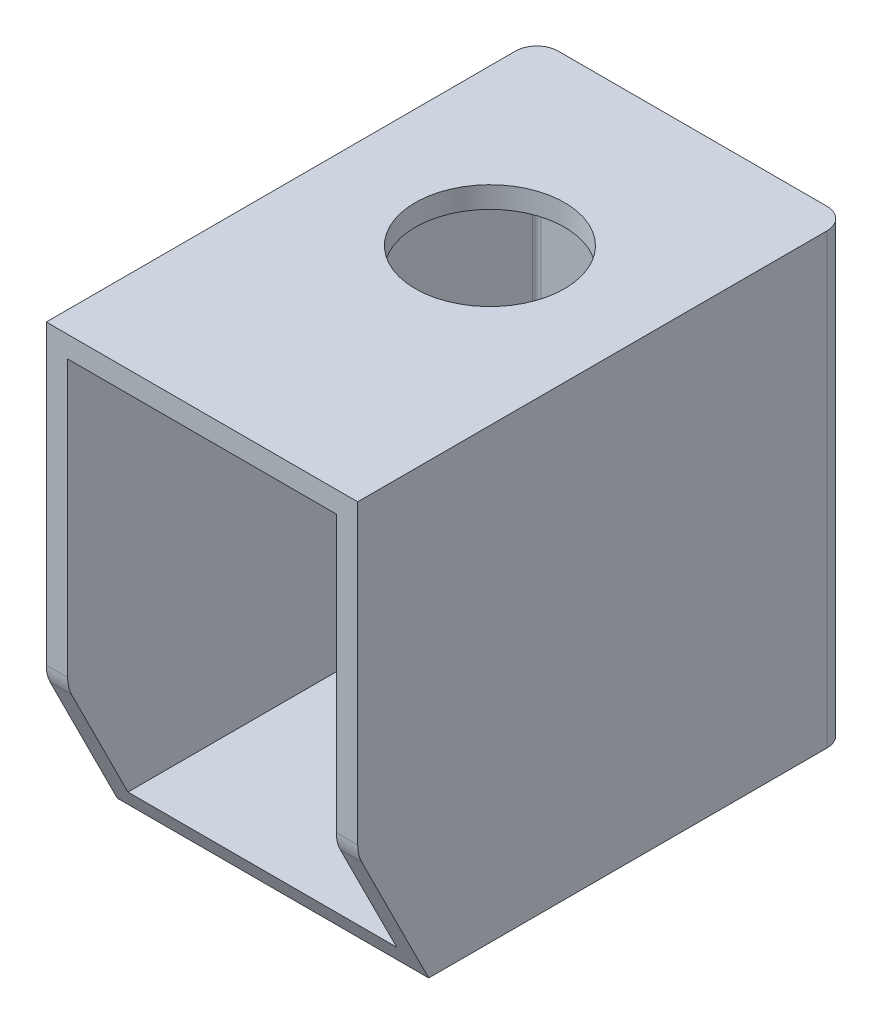
ISO-10303-21;
HEADER;
FILE_DESCRIPTION(('STEP AP214'),'2;1');
FILE_NAME('part.step','',(''),(''),'','','');
FILE_SCHEMA(('AUTOMOTIVE_DESIGN { 1 0 10303 214 1 1 1 1 }'));
ENDSEC;
DATA;
#1=APPLICATION_CONTEXT('core data for automotive mechanical design processes');
#2=APPLICATION_PROTOCOL_DEFINITION('international standard','automotive_design',2000,#1);
#3=PRODUCT_CONTEXT('',#1,'mechanical');
#4=PRODUCT('Part','Part','',(#3));
#5=PRODUCT_RELATED_PRODUCT_CATEGORY('part','',(#4));
#6=PRODUCT_DEFINITION_FORMATION('','',#4);
#7=PRODUCT_DEFINITION_CONTEXT('part definition',#1,'design');
#8=PRODUCT_DEFINITION('design','',#6,#7);
#9=PRODUCT_DEFINITION_SHAPE('','',#8);
#10=(LENGTH_UNIT() NAMED_UNIT(*) SI_UNIT(.MILLI.,.METRE.));
#11=(NAMED_UNIT(*) PLANE_ANGLE_UNIT() SI_UNIT($,.RADIAN.));
#12=(NAMED_UNIT(*) SI_UNIT($,.STERADIAN.) SOLID_ANGLE_UNIT());
#13=UNCERTAINTY_MEASURE_WITH_UNIT(LENGTH_MEASURE(1.E-05),#10,'distance_accuracy_value','');
#14=(GEOMETRIC_REPRESENTATION_CONTEXT(3) GLOBAL_UNCERTAINTY_ASSIGNED_CONTEXT((#13)) GLOBAL_UNIT_ASSIGNED_CONTEXT((#10,
#11,#12)) REPRESENTATION_CONTEXT('',''));
#15=CARTESIAN_POINT('',(0.,0.,0.));
#16=DIRECTION('',(0.,0.,1.));
#17=DIRECTION('',(1.,0.,0.));
#18=AXIS2_PLACEMENT_3D('',#15,#16,#17);
#19=CARTESIAN_POINT('',(-7.3,10.5,11.5));
#20=DIRECTION('',(0.,0.,-1.));
#21=DIRECTION('',(-1.,0.,0.));
#22=AXIS2_PLACEMENT_3D('',#19,#20,#21);
#23=PLANE('',#22);
#24=DIRECTION('',(0.,-1.,0.));
#25=VECTOR('',#24,1.);
#26=CARTESIAN_POINT('',(6.3,10.5,11.5));
#27=LINE('',#26,#25);
#28=CARTESIAN_POINT('',(6.3,9.5,11.5));
#29=VERTEX_POINT('',#28);
#30=CARTESIAN_POINT('',(6.3,-3.43396166652762,11.5));
#31=VERTEX_POINT('',#30);
#32=EDGE_CURVE('E245',#29,#31,#27,.T.);
#33=ORIENTED_EDGE('',*,*,#32,.T.);
#34=DIRECTION('',(1.,0.,0.));
#35=VECTOR('',#34,1.);
#36=CARTESIAN_POINT('',(7.3,-3.43396166652762,11.5));
#37=LINE('',#36,#35);
#38=CARTESIAN_POINT('',(7.3,-3.43396166652761,11.5));
#39=VERTEX_POINT('',#38);
#40=EDGE_CURVE('E230',#31,#39,#37,.T.);
#41=ORIENTED_EDGE('',*,*,#40,.T.);
#42=DIRECTION('',(0.,-1.,0.));
#43=VECTOR('',#42,1.);
#44=CARTESIAN_POINT('',(7.3,10.5,11.5));
#45=LINE('',#44,#43);
#46=CARTESIAN_POINT('',(7.3,10.5,11.5));
#47=VERTEX_POINT('',#46);
#48=EDGE_CURVE('E183',#47,#39,#45,.T.);
#49=ORIENTED_EDGE('',*,*,#48,.F.);
#50=DIRECTION('',(1.,0.,0.));
#51=VECTOR('',#50,1.);
#52=CARTESIAN_POINT('',(-7.3,10.5,11.5));
#53=LINE('',#52,#51);
#54=CARTESIAN_POINT('',(-7.3,10.5,11.5));
#55=VERTEX_POINT('',#54);
#56=EDGE_CURVE('E187',#55,#47,#53,.T.);
#57=ORIENTED_EDGE('',*,*,#56,.F.);
#58=DIRECTION('',(0.,-1.,0.));
#59=VECTOR('',#58,1.);
#60=CARTESIAN_POINT('',(-7.3,10.5,11.5));
#61=LINE('',#60,#59);
#62=CARTESIAN_POINT('',(-7.3,-3.43396166652761,11.5));
#63=VERTEX_POINT('',#62);
#64=EDGE_CURVE('E186',#55,#63,#61,.T.);
#65=ORIENTED_EDGE('',*,*,#64,.T.);
#66=DIRECTION('',(1.,0.,0.));
#67=VECTOR('',#66,1.);
#68=CARTESIAN_POINT('',(-6.3,-3.43396166652762,11.5));
#69=LINE('',#68,#67);
#70=CARTESIAN_POINT('',(-6.3,-3.43396166652762,11.5));
#71=VERTEX_POINT('',#70);
#72=EDGE_CURVE('E227',#63,#71,#69,.T.);
#73=ORIENTED_EDGE('',*,*,#72,.T.);
#74=DIRECTION('',(0.,-1.,0.));
#75=VECTOR('',#74,1.);
#76=CARTESIAN_POINT('',(-6.3,10.5,11.5));
#77=LINE('',#76,#75);
#78=CARTESIAN_POINT('',(-6.3,9.5,11.5));
#79=VERTEX_POINT('',#78);
#80=EDGE_CURVE('E257',#79,#71,#77,.T.);
#81=ORIENTED_EDGE('',*,*,#80,.F.);
#82=DIRECTION('',(1.,0.,0.));
#83=VECTOR('',#82,1.);
#84=CARTESIAN_POINT('',(-7.3,9.5,11.5));
#85=LINE('',#84,#83);
#86=EDGE_CURVE('E256',#79,#29,#85,.T.);
#87=ORIENTED_EDGE('',*,*,#86,.T.);
#88=EDGE_LOOP('',(#33,#41,#49,#57,#65,#73,#81,#87));
#89=FACE_BOUND('',#88,.T.);
#90=ADVANCED_FACE('F39',(#89),#23,.F.);
#91=CARTESIAN_POINT('',(7.3,10.5,-11.5));
#92=DIRECTION('',(-1.,0.,0.));
#93=DIRECTION('',(0.,0.,1.));
#94=AXIS2_PLACEMENT_3D('',#91,#92,#93);
#95=PLANE('',#94);
#96=ORIENTED_EDGE('',*,*,#48,.T.);
#97=CARTESIAN_POINT('',(7.3,-3.43396166652762,9.74));
#98=DIRECTION('',(-1.,0.,0.));
#99=DIRECTION('',(0.,0.,1.));
#100=AXIS2_PLACEMENT_3D('',#97,#98,#99);
#101=CIRCLE('',#100,1.76);
#102=CARTESIAN_POINT('',(7.3,-4.22200404976221,11.3137182728258));
#103=VERTEX_POINT('',#102);
#104=EDGE_CURVE('E233',#39,#103,#101,.F.);
#105=ORIENTED_EDGE('',*,*,#104,.T.);
#106=DIRECTION('',(0.,0.894158109560136,0.447751354110564));
#107=VECTOR('',#106,1.);
#108=CARTESIAN_POINT('',(7.3,-1.5851978977209,12.6341039098631));
#109=LINE('',#108,#107);
#110=CARTESIAN_POINT('',(7.3,-10.5,8.17));
#111=VERTEX_POINT('',#110);
#112=EDGE_CURVE('E156',#111,#103,#109,.T.);
#113=ORIENTED_EDGE('',*,*,#112,.F.);
#114=DIRECTION('',(0.,0.,-1.));
#115=VECTOR('',#114,1.);
#116=CARTESIAN_POINT('',(7.3,-10.5,-11.5));
#117=LINE('',#116,#115);
#118=CARTESIAN_POINT('',(7.3,-10.5,-10.5));
#119=VERTEX_POINT('',#118);
#120=EDGE_CURVE('E165',#111,#119,#117,.T.);
#121=ORIENTED_EDGE('',*,*,#120,.T.);
#122=DIRECTION('',(0.,-1.,0.));
#123=VECTOR('',#122,1.);
#124=CARTESIAN_POINT('',(7.3,10.5,-10.5));
#125=LINE('',#124,#123);
#126=CARTESIAN_POINT('',(7.3,10.5,-10.5));
#127=VERTEX_POINT('',#126);
#128=EDGE_CURVE('E204',#119,#127,#125,.F.);
#129=ORIENTED_EDGE('',*,*,#128,.T.);
#130=DIRECTION('',(0.,0.,-1.));
#131=VECTOR('',#130,1.);
#132=CARTESIAN_POINT('',(7.3,10.5,-11.5));
#133=LINE('',#132,#131);
#134=EDGE_CURVE('E173',#47,#127,#133,.T.);
#135=ORIENTED_EDGE('',*,*,#134,.F.);
#136=EDGE_LOOP('',(#96,#105,#113,#121,#129,#135));
#137=FACE_BOUND('',#136,.T.);
#138=ADVANCED_FACE('F261',(#137),#95,.F.);
#139=CARTESIAN_POINT('',(-7.3,10.5,-11.5));
#140=DIRECTION('',(1.,0.,0.));
#141=DIRECTION('',(0.,0.,-1.));
#142=AXIS2_PLACEMENT_3D('',#139,#140,#141);
#143=PLANE('',#142);
#144=DIRECTION('',(0.,-0.894158109560136,-0.447751354110564));
#145=VECTOR('',#144,1.);
#146=CARTESIAN_POINT('',(-7.3,-1.5851978977209,12.6341039098631));
#147=LINE('',#146,#145);
#148=CARTESIAN_POINT('',(-7.3,-4.22200404976221,11.3137182728258));
#149=VERTEX_POINT('',#148);
#150=CARTESIAN_POINT('',(-7.3,-10.5,8.17));
#151=VERTEX_POINT('',#150);
#152=EDGE_CURVE('E147',#149,#151,#147,.T.);
#153=ORIENTED_EDGE('',*,*,#152,.F.);
#154=CARTESIAN_POINT('',(-7.3,-3.43396166652762,9.74));
#155=DIRECTION('',(1.,0.,0.));
#156=DIRECTION('',(0.,0.,-1.));
#157=AXIS2_PLACEMENT_3D('',#154,#155,#156);
#158=CIRCLE('',#157,1.76);
#159=EDGE_CURVE('E11',#149,#63,#158,.F.);
#160=ORIENTED_EDGE('',*,*,#159,.T.);
#161=ORIENTED_EDGE('',*,*,#64,.F.);
#162=DIRECTION('',(0.,0.,1.));
#163=VECTOR('',#162,1.);
#164=CARTESIAN_POINT('',(-7.3,10.5,-11.5));
#165=LINE('',#164,#163);
#166=CARTESIAN_POINT('',(-7.3,10.5,-10.5));
#167=VERTEX_POINT('',#166);
#168=EDGE_CURVE('E298',#167,#55,#165,.T.);
#169=ORIENTED_EDGE('',*,*,#168,.F.);
#170=DIRECTION('',(0.,-1.,0.));
#171=VECTOR('',#170,1.);
#172=CARTESIAN_POINT('',(-7.3,10.5,-10.5));
#173=LINE('',#172,#171);
#174=CARTESIAN_POINT('',(-7.3,-10.5,-10.5));
#175=VERTEX_POINT('',#174);
#176=EDGE_CURVE('E172',#167,#175,#173,.T.);
#177=ORIENTED_EDGE('',*,*,#176,.T.);
#178=DIRECTION('',(0.,0.,1.));
#179=VECTOR('',#178,1.);
#180=CARTESIAN_POINT('',(-7.3,-10.5,-11.5));
#181=LINE('',#180,#179);
#182=EDGE_CURVE('E163',#175,#151,#181,.T.);
#183=ORIENTED_EDGE('',*,*,#182,.T.);
#184=EDGE_LOOP('',(#153,#160,#161,#169,#177,#183));
#185=FACE_BOUND('',#184,.T.);
#186=ADVANCED_FACE('F169',(#185),#143,.F.);
#187=CARTESIAN_POINT('',(0.,-10.5,0.));
#188=DIRECTION('',(0.,1.,0.));
#189=DIRECTION('',(0.,0.,1.));
#190=AXIS2_PLACEMENT_3D('',#187,#188,#189);
#191=PLANE('',#190);
#192=CARTESIAN_POINT('',(0.,-10.5,-2.));
#193=DIRECTION('',(0.,1.,0.));
#194=DIRECTION('',(0.,0.,1.));
#195=AXIS2_PLACEMENT_3D('',#192,#193,#194);
#196=CIRCLE('',#195,4.1);
#197=CARTESIAN_POINT('',(0.,-10.5,2.1));
#198=VERTEX_POINT('',#197);
#199=EDGE_CURVE('E266',#198,#198,#196,.T.);
#200=ORIENTED_EDGE('',*,*,#199,.T.);
#201=EDGE_LOOP('',(#200));
#202=FACE_BOUND('',#201,.T.);
#203=DIRECTION('',(1.,0.,0.));
#204=VECTOR('',#203,1.);
#205=CARTESIAN_POINT('',(-52.1213661255228,-10.5,8.17));
#206=LINE('',#205,#204);
#207=EDGE_CURVE('E151',#151,#111,#206,.T.);
#208=ORIENTED_EDGE('',*,*,#207,.F.);
#209=ORIENTED_EDGE('',*,*,#182,.F.);
#210=CARTESIAN_POINT('',(-6.3,-10.5,-10.5));
#211=DIRECTION('',(0.,1.,0.));
#212=DIRECTION('',(0.,0.,1.));
#213=AXIS2_PLACEMENT_3D('',#210,#211,#212);
#214=CIRCLE('',#213,1.);
#215=CARTESIAN_POINT('',(-6.3,-10.5,-11.5));
#216=VERTEX_POINT('',#215);
#217=EDGE_CURVE('E193',#175,#216,#214,.F.);
#218=ORIENTED_EDGE('',*,*,#217,.T.);
#219=DIRECTION('',(-1.,0.,0.));
#220=VECTOR('',#219,1.);
#221=CARTESIAN_POINT('',(-7.3,-10.5,-11.5));
#222=LINE('',#221,#220);
#223=CARTESIAN_POINT('',(6.3,-10.5,-11.5));
#224=VERTEX_POINT('',#223);
#225=EDGE_CURVE('E174',#224,#216,#222,.T.);
#226=ORIENTED_EDGE('',*,*,#225,.F.);
#227=CARTESIAN_POINT('',(6.3,-10.5,-10.5));
#228=DIRECTION('',(0.,1.,0.));
#229=DIRECTION('',(0.,0.,1.));
#230=AXIS2_PLACEMENT_3D('',#227,#228,#229);
#231=CIRCLE('',#230,1.);
#232=EDGE_CURVE('E191',#224,#119,#231,.F.);
#233=ORIENTED_EDGE('',*,*,#232,.T.);
#234=ORIENTED_EDGE('',*,*,#120,.F.);
#235=EDGE_LOOP('',(#208,#209,#218,#226,#233,#234));
#236=FACE_BOUND('',#235,.T.);
#237=ADVANCED_FACE('F162',(#202,#236),#191,.F.);
#238=CARTESIAN_POINT('',(6.3,10.5,-11.5));
#239=DIRECTION('',(-1.,0.,0.));
#240=DIRECTION('',(0.,0.,1.));
#241=AXIS2_PLACEMENT_3D('',#238,#239,#240);
#242=PLANE('',#241);
#243=DIRECTION('',(0.,0.894158109560136,0.447751354110564));
#244=VECTOR('',#243,1.);
#245=CARTESIAN_POINT('',(6.3,-1.5851978977209,12.6341039098631));
#246=LINE('',#245,#244);
#247=CARTESIAN_POINT('',(6.3,-9.5,8.67075187969925));
#248=VERTEX_POINT('',#247);
#249=CARTESIAN_POINT('',(6.3,-4.22200404976221,11.3137182728258));
#250=VERTEX_POINT('',#249);
#251=EDGE_CURVE('E157',#248,#250,#246,.T.);
#252=ORIENTED_EDGE('',*,*,#251,.T.);
#253=CARTESIAN_POINT('',(6.3,-3.43396166652762,9.74));
#254=DIRECTION('',(-1.,0.,0.));
#255=DIRECTION('',(0.,0.,1.));
#256=AXIS2_PLACEMENT_3D('',#253,#254,#255);
#257=CIRCLE('',#256,1.76);
#258=EDGE_CURVE('E238',#250,#31,#257,.T.);
#259=ORIENTED_EDGE('',*,*,#258,.T.);
#260=ORIENTED_EDGE('',*,*,#32,.F.);
#261=DIRECTION('',(0.,0.,-1.));
#262=VECTOR('',#261,1.);
#263=CARTESIAN_POINT('',(6.3,9.5,-11.5));
#264=LINE('',#263,#262);
#265=CARTESIAN_POINT('',(6.3,9.5,-10.3));
#266=VERTEX_POINT('',#265);
#267=EDGE_CURVE('E282',#29,#266,#264,.T.);
#268=ORIENTED_EDGE('',*,*,#267,.T.);
#269=DIRECTION('',(0.,1.,0.));
#270=VECTOR('',#269,1.);
#271=CARTESIAN_POINT('',(6.3,-9.5,-10.3));
#272=LINE('',#271,#270);
#273=CARTESIAN_POINT('',(6.3,-9.5,-10.3));
#274=VERTEX_POINT('',#273);
#275=EDGE_CURVE('E218',#266,#274,#272,.F.);
#276=ORIENTED_EDGE('',*,*,#275,.T.);
#277=DIRECTION('',(0.,0.,-1.));
#278=VECTOR('',#277,1.);
#279=CARTESIAN_POINT('',(6.3,-9.5,-11.5));
#280=LINE('',#279,#278);
#281=EDGE_CURVE('E278',#248,#274,#280,.T.);
#282=ORIENTED_EDGE('',*,*,#281,.F.);
#283=EDGE_LOOP('',(#252,#259,#260,#268,#276,#282));
#284=FACE_BOUND('',#283,.T.);
#285=ADVANCED_FACE('F243',(#284),#242,.T.);
#286=CARTESIAN_POINT('',(-6.3,10.5,-11.5));
#287=DIRECTION('',(1.,0.,0.));
#288=DIRECTION('',(0.,0.,-1.));
#289=AXIS2_PLACEMENT_3D('',#286,#287,#288);
#290=PLANE('',#289);
#291=ORIENTED_EDGE('',*,*,#80,.T.);
#292=CARTESIAN_POINT('',(-6.3,-3.43396166652762,9.74));
#293=DIRECTION('',(1.,0.,0.));
#294=DIRECTION('',(0.,0.,-1.));
#295=AXIS2_PLACEMENT_3D('',#292,#293,#294);
#296=CIRCLE('',#295,1.76);
#297=CARTESIAN_POINT('',(-6.3,-4.22200404976221,11.3137182728258));
#298=VERTEX_POINT('',#297);
#299=EDGE_CURVE('E47',#71,#298,#296,.T.);
#300=ORIENTED_EDGE('',*,*,#299,.T.);
#301=DIRECTION('',(0.,-0.894158109560136,-0.447751354110564));
#302=VECTOR('',#301,1.);
#303=CARTESIAN_POINT('',(-6.3,-1.5851978977209,12.6341039098631));
#304=LINE('',#303,#302);
#305=CARTESIAN_POINT('',(-6.3,-9.5,8.67075187969925));
#306=VERTEX_POINT('',#305);
#307=EDGE_CURVE('E166',#298,#306,#304,.T.);
#308=ORIENTED_EDGE('',*,*,#307,.T.);
#309=DIRECTION('',(0.,0.,1.));
#310=VECTOR('',#309,1.);
#311=CARTESIAN_POINT('',(-6.3,-9.5,-11.5));
#312=LINE('',#311,#310);
#313=CARTESIAN_POINT('',(-6.3,-9.5,-10.3));
#314=VERTEX_POINT('',#313);
#315=EDGE_CURVE('E285',#314,#306,#312,.T.);
#316=ORIENTED_EDGE('',*,*,#315,.F.);
#317=DIRECTION('',(0.,1.,0.));
#318=VECTOR('',#317,1.);
#319=CARTESIAN_POINT('',(-6.3,9.5,-10.3));
#320=LINE('',#319,#318);
#321=CARTESIAN_POINT('',(-6.3,9.5,-10.3));
#322=VERTEX_POINT('',#321);
#323=EDGE_CURVE('E224',#314,#322,#320,.T.);
#324=ORIENTED_EDGE('',*,*,#323,.T.);
#325=DIRECTION('',(0.,0.,1.));
#326=VECTOR('',#325,1.);
#327=CARTESIAN_POINT('',(-6.3,9.5,-11.5));
#328=LINE('',#327,#326);
#329=EDGE_CURVE('E290',#322,#79,#328,.T.);
#330=ORIENTED_EDGE('',*,*,#329,.T.);
#331=EDGE_LOOP('',(#291,#300,#308,#316,#324,#330));
#332=FACE_BOUND('',#331,.T.);
#333=ADVANCED_FACE('F358',(#332),#290,.T.);
#334=CARTESIAN_POINT('',(0.,-9.5,0.));
#335=DIRECTION('',(0.,1.,0.));
#336=DIRECTION('',(0.,0.,1.));
#337=AXIS2_PLACEMENT_3D('',#334,#335,#336);
#338=PLANE('',#337);
#339=CARTESIAN_POINT('',(0.,-9.5,-2.));
#340=DIRECTION('',(0.,1.,0.));
#341=DIRECTION('',(0.,0.,1.));
#342=AXIS2_PLACEMENT_3D('',#339,#340,#341);
#343=CIRCLE('',#342,4.1);
#344=CARTESIAN_POINT('',(0.,-9.5,2.1));
#345=VERTEX_POINT('',#344);
#346=EDGE_CURVE('E263',#345,#345,#343,.T.);
#347=ORIENTED_EDGE('',*,*,#346,.F.);
#348=EDGE_LOOP('',(#347));
#349=FACE_BOUND('',#348,.T.);
#350=ORIENTED_EDGE('',*,*,#281,.T.);
#351=CARTESIAN_POINT('',(6.1,-9.5,-10.3));
#352=DIRECTION('',(0.,1.,0.));
#353=DIRECTION('',(0.,0.,1.));
#354=AXIS2_PLACEMENT_3D('',#351,#352,#353);
#355=CIRCLE('',#354,0.2);
#356=CARTESIAN_POINT('',(6.1,-9.5,-10.5));
#357=VERTEX_POINT('',#356);
#358=EDGE_CURVE('E222',#274,#357,#355,.T.);
#359=ORIENTED_EDGE('',*,*,#358,.T.);
#360=DIRECTION('',(-1.,0.,0.));
#361=VECTOR('',#360,1.);
#362=CARTESIAN_POINT('',(-7.3,-9.5,-10.5));
#363=LINE('',#362,#361);
#364=CARTESIAN_POINT('',(-6.1,-9.5,-10.5));
#365=VERTEX_POINT('',#364);
#366=EDGE_CURVE('E281',#357,#365,#363,.T.);
#367=ORIENTED_EDGE('',*,*,#366,.T.);
#368=CARTESIAN_POINT('',(-6.1,-9.5,-10.3));
#369=DIRECTION('',(0.,1.,0.));
#370=DIRECTION('',(0.,0.,1.));
#371=AXIS2_PLACEMENT_3D('',#368,#369,#370);
#372=CIRCLE('',#371,0.2);
#373=EDGE_CURVE('E220',#365,#314,#372,.T.);
#374=ORIENTED_EDGE('',*,*,#373,.T.);
#375=ORIENTED_EDGE('',*,*,#315,.T.);
#376=DIRECTION('',(1.,0.,0.));
#377=VECTOR('',#376,1.);
#378=CARTESIAN_POINT('',(0.,-9.5,8.67075187969925));
#379=LINE('',#378,#377);
#380=EDGE_CURVE('E206',#306,#248,#379,.T.);
#381=ORIENTED_EDGE('',*,*,#380,.T.);
#382=EDGE_LOOP('',(#350,#359,#367,#374,#375,#381));
#383=FACE_BOUND('',#382,.T.);
#384=ADVANCED_FACE('F336',(#349,#383),#338,.T.);
#385=CARTESIAN_POINT('',(-7.3,10.5,-11.5));
#386=DIRECTION('',(0.,0.,1.));
#387=DIRECTION('',(1.,0.,0.));
#388=AXIS2_PLACEMENT_3D('',#385,#386,#387);
#389=PLANE('',#388);
#390=ORIENTED_EDGE('',*,*,#225,.T.);
#391=DIRECTION('',(0.,-1.,0.));
#392=VECTOR('',#391,1.);
#393=CARTESIAN_POINT('',(-6.3,10.5,-11.5));
#394=LINE('',#393,#392);
#395=CARTESIAN_POINT('',(-6.3,10.5,-11.5));
#396=VERTEX_POINT('',#395);
#397=EDGE_CURVE('E198',#216,#396,#394,.F.);
#398=ORIENTED_EDGE('',*,*,#397,.T.);
#399=DIRECTION('',(-1.,0.,0.));
#400=VECTOR('',#399,1.);
#401=CARTESIAN_POINT('',(-7.3,10.5,-11.5));
#402=LINE('',#401,#400);
#403=CARTESIAN_POINT('',(6.3,10.5,-11.5));
#404=VERTEX_POINT('',#403);
#405=EDGE_CURVE('E177',#404,#396,#402,.T.);
#406=ORIENTED_EDGE('',*,*,#405,.F.);
#407=DIRECTION('',(0.,-1.,0.));
#408=VECTOR('',#407,1.);
#409=CARTESIAN_POINT('',(6.3,10.5,-11.5));
#410=LINE('',#409,#408);
#411=EDGE_CURVE('E195',#404,#224,#410,.T.);
#412=ORIENTED_EDGE('',*,*,#411,.T.);
#413=EDGE_LOOP('',(#390,#398,#406,#412));
#414=FACE_BOUND('',#413,.T.);
#415=ADVANCED_FACE('F311',(#414),#389,.F.);
#416=CARTESIAN_POINT('',(0.,10.5,0.));
#417=DIRECTION('',(0.,1.,0.));
#418=DIRECTION('',(0.,0.,1.));
#419=AXIS2_PLACEMENT_3D('',#416,#417,#418);
#420=PLANE('',#419);
#421=CARTESIAN_POINT('',(0.,10.5,-2.));
#422=DIRECTION('',(0.,1.,0.));
#423=DIRECTION('',(0.,0.,1.));
#424=AXIS2_PLACEMENT_3D('',#421,#422,#423);
#425=CIRCLE('',#424,3.5);
#426=CARTESIAN_POINT('',(0.,10.5,1.5));
#427=VERTEX_POINT('',#426);
#428=EDGE_CURVE('E271',#427,#427,#425,.T.);
#429=ORIENTED_EDGE('',*,*,#428,.F.);
#430=EDGE_LOOP('',(#429));
#431=FACE_BOUND('',#430,.T.);
#432=ORIENTED_EDGE('',*,*,#405,.T.);
#433=CARTESIAN_POINT('',(-6.3,10.5,-10.5));
#434=DIRECTION('',(0.,1.,0.));
#435=DIRECTION('',(0.,0.,1.));
#436=AXIS2_PLACEMENT_3D('',#433,#434,#435);
#437=CIRCLE('',#436,1.);
#438=EDGE_CURVE('E202',#396,#167,#437,.T.);
#439=ORIENTED_EDGE('',*,*,#438,.T.);
#440=ORIENTED_EDGE('',*,*,#168,.T.);
#441=ORIENTED_EDGE('',*,*,#56,.T.);
#442=ORIENTED_EDGE('',*,*,#134,.T.);
#443=CARTESIAN_POINT('',(6.3,10.5,-10.5));
#444=DIRECTION('',(0.,1.,0.));
#445=DIRECTION('',(0.,0.,1.));
#446=AXIS2_PLACEMENT_3D('',#443,#444,#445);
#447=CIRCLE('',#446,1.);
#448=EDGE_CURVE('E200',#127,#404,#447,.T.);
#449=ORIENTED_EDGE('',*,*,#448,.T.);
#450=EDGE_LOOP('',(#432,#439,#440,#441,#442,#449));
#451=FACE_BOUND('',#450,.T.);
#452=ADVANCED_FACE('F308',(#431,#451),#420,.T.);
#453=CARTESIAN_POINT('',(-6.3,10.5,-10.5));
#454=DIRECTION('',(0.,-1.,0.));
#455=DIRECTION('',(0.,0.,-1.));
#456=AXIS2_PLACEMENT_3D('',#453,#454,#455);
#457=CYLINDRICAL_SURFACE('',#456,1.);
#458=ORIENTED_EDGE('',*,*,#438,.F.);
#459=ORIENTED_EDGE('',*,*,#397,.F.);
#460=ORIENTED_EDGE('',*,*,#217,.F.);
#461=ORIENTED_EDGE('',*,*,#176,.F.);
#462=EDGE_LOOP('',(#458,#459,#460,#461));
#463=FACE_BOUND('',#462,.T.);
#464=ADVANCED_FACE('F314',(#463),#457,.T.);
#465=CARTESIAN_POINT('',(6.3,10.5,-10.5));
#466=DIRECTION('',(0.,-1.,0.));
#467=DIRECTION('',(0.,0.,-1.));
#468=AXIS2_PLACEMENT_3D('',#465,#466,#467);
#469=CYLINDRICAL_SURFACE('',#468,1.);
#470=ORIENTED_EDGE('',*,*,#448,.F.);
#471=ORIENTED_EDGE('',*,*,#128,.F.);
#472=ORIENTED_EDGE('',*,*,#232,.F.);
#473=ORIENTED_EDGE('',*,*,#411,.F.);
#474=EDGE_LOOP('',(#470,#471,#472,#473));
#475=FACE_BOUND('',#474,.T.);
#476=ADVANCED_FACE('F305',(#475),#469,.T.);
#477=CARTESIAN_POINT('',(-7.3,10.5,-10.5));
#478=DIRECTION('',(0.,0.,1.));
#479=DIRECTION('',(1.,0.,0.));
#480=AXIS2_PLACEMENT_3D('',#477,#478,#479);
#481=PLANE('',#480);
#482=ORIENTED_EDGE('',*,*,#366,.F.);
#483=DIRECTION('',(0.,1.,0.));
#484=VECTOR('',#483,1.);
#485=CARTESIAN_POINT('',(6.1,9.5,-10.5));
#486=LINE('',#485,#484);
#487=CARTESIAN_POINT('',(6.1,9.5,-10.5));
#488=VERTEX_POINT('',#487);
#489=EDGE_CURVE('E211',#357,#488,#486,.T.);
#490=ORIENTED_EDGE('',*,*,#489,.T.);
#491=DIRECTION('',(-1.,0.,0.));
#492=VECTOR('',#491,1.);
#493=CARTESIAN_POINT('',(-7.3,9.5,-10.5));
#494=LINE('',#493,#492);
#495=CARTESIAN_POINT('',(-6.1,9.5,-10.5));
#496=VERTEX_POINT('',#495);
#497=EDGE_CURVE('E284',#488,#496,#494,.T.);
#498=ORIENTED_EDGE('',*,*,#497,.T.);
#499=DIRECTION('',(0.,1.,0.));
#500=VECTOR('',#499,1.);
#501=CARTESIAN_POINT('',(-6.1,-9.5,-10.5));
#502=LINE('',#501,#500);
#503=EDGE_CURVE('E209',#496,#365,#502,.F.);
#504=ORIENTED_EDGE('',*,*,#503,.T.);
#505=EDGE_LOOP('',(#482,#490,#498,#504));
#506=FACE_BOUND('',#505,.T.);
#507=ADVANCED_FACE('F342',(#506),#481,.T.);
#508=CARTESIAN_POINT('',(0.,9.5,0.));
#509=DIRECTION('',(0.,1.,0.));
#510=DIRECTION('',(0.,0.,1.));
#511=AXIS2_PLACEMENT_3D('',#508,#509,#510);
#512=PLANE('',#511);
#513=CARTESIAN_POINT('',(0.,9.5,-2.));
#514=DIRECTION('',(0.,1.,0.));
#515=DIRECTION('',(0.,0.,1.));
#516=AXIS2_PLACEMENT_3D('',#513,#514,#515);
#517=CIRCLE('',#516,3.5);
#518=CARTESIAN_POINT('',(0.,9.5,1.5));
#519=VERTEX_POINT('',#518);
#520=EDGE_CURVE('E275',#519,#519,#517,.F.);
#521=ORIENTED_EDGE('',*,*,#520,.F.);
#522=EDGE_LOOP('',(#521));
#523=FACE_BOUND('',#522,.T.);
#524=ORIENTED_EDGE('',*,*,#497,.F.);
#525=CARTESIAN_POINT('',(6.1,9.5,-10.3));
#526=DIRECTION('',(0.,1.,0.));
#527=DIRECTION('',(0.,0.,1.));
#528=AXIS2_PLACEMENT_3D('',#525,#526,#527);
#529=CIRCLE('',#528,0.2);
#530=EDGE_CURVE('E216',#488,#266,#529,.F.);
#531=ORIENTED_EDGE('',*,*,#530,.T.);
#532=ORIENTED_EDGE('',*,*,#267,.F.);
#533=ORIENTED_EDGE('',*,*,#86,.F.);
#534=ORIENTED_EDGE('',*,*,#329,.F.);
#535=CARTESIAN_POINT('',(-6.1,9.5,-10.3));
#536=DIRECTION('',(0.,1.,0.));
#537=DIRECTION('',(0.,0.,1.));
#538=AXIS2_PLACEMENT_3D('',#535,#536,#537);
#539=CIRCLE('',#538,0.2);
#540=EDGE_CURVE('E214',#322,#496,#539,.F.);
#541=ORIENTED_EDGE('',*,*,#540,.T.);
#542=EDGE_LOOP('',(#524,#531,#532,#533,#534,#541));
#543=FACE_BOUND('',#542,.T.);
#544=ADVANCED_FACE('F367',(#523,#543),#512,.F.);
#545=CARTESIAN_POINT('',(0.,-10.501,-2.));
#546=DIRECTION('',(0.,1.,0.));
#547=DIRECTION('',(0.,0.,1.));
#548=AXIS2_PLACEMENT_3D('',#545,#546,#547);
#549=CYLINDRICAL_SURFACE('',#548,3.5);
#550=ORIENTED_EDGE('',*,*,#428,.T.);
#551=EDGE_LOOP('',(#550));
#552=FACE_BOUND('',#551,.T.);
#553=ORIENTED_EDGE('',*,*,#520,.T.);
#554=EDGE_LOOP('',(#553));
#555=FACE_BOUND('',#554,.T.);
#556=ADVANCED_FACE('F369',(#552,#555),#549,.F.);
#557=CARTESIAN_POINT('',(0.,-10.5,-2.));
#558=DIRECTION('',(0.,1.,0.));
#559=DIRECTION('',(0.,0.,1.));
#560=AXIS2_PLACEMENT_3D('',#557,#558,#559);
#561=CYLINDRICAL_SURFACE('',#560,4.1);
#562=ORIENTED_EDGE('',*,*,#199,.F.);
#563=EDGE_LOOP('',(#562));
#564=FACE_BOUND('',#563,.T.);
#565=ORIENTED_EDGE('',*,*,#346,.T.);
#566=EDGE_LOOP('',(#565));
#567=FACE_BOUND('',#566,.T.);
#568=ADVANCED_FACE('F376',(#564,#567),#561,.F.);
#569=CARTESIAN_POINT('',(-52.1213661255228,-3.85,11.5));
#570=DIRECTION('',(0.,-0.447751354110564,0.894158109560136));
#571=DIRECTION('',(0.,-0.894158109560136,-0.447751354110564));
#572=AXIS2_PLACEMENT_3D('',#569,#570,#571);
#573=PLANE('',#572);
#574=ORIENTED_EDGE('',*,*,#112,.T.);
#575=DIRECTION('',(1.,0.,0.));
#576=VECTOR('',#575,1.);
#577=CARTESIAN_POINT('',(6.3,-4.22200404976221,11.3137182728258));
#578=LINE('',#577,#576);
#579=EDGE_CURVE('E236',#103,#250,#578,.F.);
#580=ORIENTED_EDGE('',*,*,#579,.T.);
#581=ORIENTED_EDGE('',*,*,#251,.F.);
#582=ORIENTED_EDGE('',*,*,#380,.F.);
#583=ORIENTED_EDGE('',*,*,#307,.F.);
#584=DIRECTION('',(1.,0.,0.));
#585=VECTOR('',#584,1.);
#586=CARTESIAN_POINT('',(-7.3,-4.22200404976221,11.3137182728258));
#587=LINE('',#586,#585);
#588=EDGE_CURVE('E54',#298,#149,#587,.F.);
#589=ORIENTED_EDGE('',*,*,#588,.T.);
#590=ORIENTED_EDGE('',*,*,#152,.T.);
#591=ORIENTED_EDGE('',*,*,#207,.T.);
#592=EDGE_LOOP('',(#574,#580,#581,#582,#583,#589,#590,#591));
#593=FACE_BOUND('',#592,.T.);
#594=ADVANCED_FACE('F150',(#593),#573,.T.);
#595=CARTESIAN_POINT('',(6.1,10.5,-10.3));
#596=DIRECTION('',(0.,-1.,0.));
#597=DIRECTION('',(0.,0.,-1.));
#598=AXIS2_PLACEMENT_3D('',#595,#596,#597);
#599=CYLINDRICAL_SURFACE('',#598,0.2);
#600=ORIENTED_EDGE('',*,*,#358,.F.);
#601=ORIENTED_EDGE('',*,*,#275,.F.);
#602=ORIENTED_EDGE('',*,*,#530,.F.);
#603=ORIENTED_EDGE('',*,*,#489,.F.);
#604=EDGE_LOOP('',(#600,#601,#602,#603));
#605=FACE_BOUND('',#604,.T.);
#606=ADVANCED_FACE('F343',(#605),#599,.F.);
#607=CARTESIAN_POINT('',(-6.1,10.5,-10.3));
#608=DIRECTION('',(0.,-1.,0.));
#609=DIRECTION('',(0.,0.,-1.));
#610=AXIS2_PLACEMENT_3D('',#607,#608,#609);
#611=CYLINDRICAL_SURFACE('',#610,0.2);
#612=ORIENTED_EDGE('',*,*,#373,.F.);
#613=ORIENTED_EDGE('',*,*,#503,.F.);
#614=ORIENTED_EDGE('',*,*,#540,.F.);
#615=ORIENTED_EDGE('',*,*,#323,.F.);
#616=EDGE_LOOP('',(#612,#613,#614,#615));
#617=FACE_BOUND('',#616,.T.);
#618=ADVANCED_FACE('F323',(#617),#611,.F.);
#619=CARTESIAN_POINT('',(-7.3,-3.43396166652762,9.74));
#620=DIRECTION('',(-1.,0.,0.));
#621=DIRECTION('',(0.,0.,1.));
#622=AXIS2_PLACEMENT_3D('',#619,#620,#621);
#623=CYLINDRICAL_SURFACE('',#622,1.76);
#624=ORIENTED_EDGE('',*,*,#258,.F.);
#625=ORIENTED_EDGE('',*,*,#579,.F.);
#626=ORIENTED_EDGE('',*,*,#104,.F.);
#627=ORIENTED_EDGE('',*,*,#40,.F.);
#628=EDGE_LOOP('',(#624,#625,#626,#627));
#629=FACE_BOUND('',#628,.T.);
#630=ADVANCED_FACE('F259',(#629),#623,.T.);
#631=CARTESIAN_POINT('',(-7.3,-3.43396166652762,9.74));
#632=DIRECTION('',(-1.,0.,0.));
#633=DIRECTION('',(0.,0.,1.));
#634=AXIS2_PLACEMENT_3D('',#631,#632,#633);
#635=CYLINDRICAL_SURFACE('',#634,1.76);
#636=ORIENTED_EDGE('',*,*,#159,.F.);
#637=ORIENTED_EDGE('',*,*,#588,.F.);
#638=ORIENTED_EDGE('',*,*,#299,.F.);
#639=ORIENTED_EDGE('',*,*,#72,.F.);
#640=EDGE_LOOP('',(#636,#637,#638,#639));
#641=FACE_BOUND('',#640,.T.);
#642=ADVANCED_FACE('F41',(#641),#635,.T.);
#643=CLOSED_SHELL('',(#90,#138,#186,#237,#285,#333,#384,#415,#452,#464,#476,#507,#544,#556,#568,
#594,#606,#618,#630,#642));
#644=MANIFOLD_SOLID_BREP('B2',#643);
#645=ADVANCED_BREP_SHAPE_REPRESENTATION('',(#18,#644),#14);
#646=SHAPE_DEFINITION_REPRESENTATION(#9,#645);
ENDSEC;
END-ISO-10303-21;
